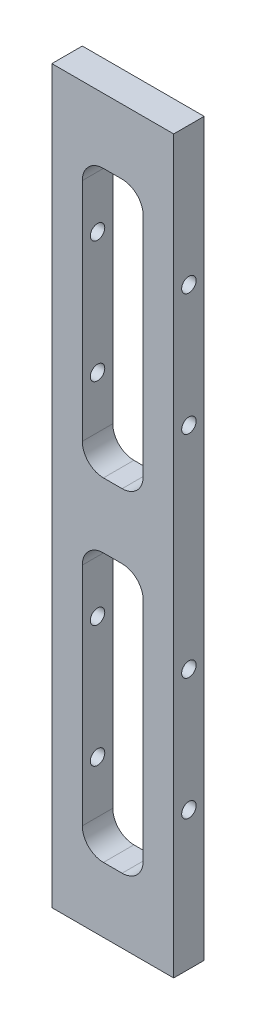
ISO-10303-21;
HEADER;
FILE_DESCRIPTION(('STEP AP214'),'2;1');
FILE_NAME('part.step','',(''),(''),'','','');
FILE_SCHEMA(('AUTOMOTIVE_DESIGN { 1 0 10303 214 1 1 1 1 }'));
ENDSEC;
DATA;
#1=APPLICATION_CONTEXT('core data for automotive mechanical design processes');
#2=APPLICATION_PROTOCOL_DEFINITION('international standard','automotive_design',2000,#1);
#3=PRODUCT_CONTEXT('',#1,'mechanical');
#4=PRODUCT('Part','Part','',(#3));
#5=PRODUCT_RELATED_PRODUCT_CATEGORY('part','',(#4));
#6=PRODUCT_DEFINITION_FORMATION('','',#4);
#7=PRODUCT_DEFINITION_CONTEXT('part definition',#1,'design');
#8=PRODUCT_DEFINITION('design','',#6,#7);
#9=PRODUCT_DEFINITION_SHAPE('','',#8);
#10=(LENGTH_UNIT() NAMED_UNIT(*) SI_UNIT(.MILLI.,.METRE.));
#11=(NAMED_UNIT(*) PLANE_ANGLE_UNIT() SI_UNIT($,.RADIAN.));
#12=(NAMED_UNIT(*) SI_UNIT($,.STERADIAN.) SOLID_ANGLE_UNIT());
#13=UNCERTAINTY_MEASURE_WITH_UNIT(LENGTH_MEASURE(1.E-05),#10,'distance_accuracy_value','');
#14=(GEOMETRIC_REPRESENTATION_CONTEXT(3) GLOBAL_UNCERTAINTY_ASSIGNED_CONTEXT((#13)) GLOBAL_UNIT_ASSIGNED_CONTEXT((#10,
#11,#12)) REPRESENTATION_CONTEXT('',''));
#15=CARTESIAN_POINT('',(0.,0.,0.));
#16=DIRECTION('',(0.,0.,1.));
#17=DIRECTION('',(1.,0.,0.));
#18=AXIS2_PLACEMENT_3D('',#15,#16,#17);
#19=CARTESIAN_POINT('',(9.525,-57.15,-4.7625));
#20=DIRECTION('',(-1.,0.,0.));
#21=DIRECTION('',(0.,0.,-1.));
#22=AXIS2_PLACEMENT_3D('',#19,#20,#21);
#23=PLANE('',#22);
#24=CARTESIAN_POINT('',(9.525,35.56,-2.38125));
#25=DIRECTION('',(-1.,0.,0.));
#26=DIRECTION('',(0.,0.,1.));
#27=AXIS2_PLACEMENT_3D('',#24,#25,#26);
#28=CIRCLE('',#27,1.13029999999999);
#29=CARTESIAN_POINT('',(9.525,35.56,-1.25095000000001));
#30=VERTEX_POINT('',#29);
#31=EDGE_CURVE('E634',#30,#30,#28,.T.);
#32=ORIENTED_EDGE('',*,*,#31,.T.);
#33=EDGE_LOOP('',(#32));
#34=FACE_BOUND('',#33,.T.);
#35=CARTESIAN_POINT('',(9.525,16.51,-2.38125));
#36=DIRECTION('',(-1.,0.,0.));
#37=DIRECTION('',(0.,0.,1.));
#38=AXIS2_PLACEMENT_3D('',#35,#36,#37);
#39=CIRCLE('',#38,1.13029999999999);
#40=CARTESIAN_POINT('',(9.525,16.51,-1.25095000000001));
#41=VERTEX_POINT('',#40);
#42=EDGE_CURVE('E315',#41,#41,#39,.T.);
#43=ORIENTED_EDGE('',*,*,#42,.T.);
#44=EDGE_LOOP('',(#43));
#45=FACE_BOUND('',#44,.T.);
#46=CARTESIAN_POINT('',(9.525,-16.51,-2.38124999999999));
#47=DIRECTION('',(-1.,0.,0.));
#48=DIRECTION('',(0.,0.,1.));
#49=AXIS2_PLACEMENT_3D('',#46,#47,#48);
#50=CIRCLE('',#49,1.13029999999999);
#51=CARTESIAN_POINT('',(9.525,-16.51,-1.25095));
#52=VERTEX_POINT('',#51);
#53=EDGE_CURVE('E312',#52,#52,#50,.T.);
#54=ORIENTED_EDGE('',*,*,#53,.T.);
#55=EDGE_LOOP('',(#54));
#56=FACE_BOUND('',#55,.T.);
#57=CARTESIAN_POINT('',(9.525,-35.56,-2.38124999999999));
#58=DIRECTION('',(-1.,0.,0.));
#59=DIRECTION('',(0.,0.,1.));
#60=AXIS2_PLACEMENT_3D('',#57,#58,#59);
#61=CIRCLE('',#60,1.13029999999999);
#62=CARTESIAN_POINT('',(9.525,-35.56,-1.25095));
#63=VERTEX_POINT('',#62);
#64=EDGE_CURVE('E330',#63,#63,#61,.T.);
#65=ORIENTED_EDGE('',*,*,#64,.T.);
#66=EDGE_LOOP('',(#65));
#67=FACE_BOUND('',#66,.T.);
#68=DIRECTION('',(0.,1.,0.));
#69=VECTOR('',#68,1.);
#70=CARTESIAN_POINT('',(9.525,-57.15,0.));
#71=LINE('',#70,#69);
#72=CARTESIAN_POINT('',(9.525,-57.15,0.));
#73=VERTEX_POINT('',#72);
#74=CARTESIAN_POINT('',(9.525,57.15,0.));
#75=VERTEX_POINT('',#74);
#76=EDGE_CURVE('E214',#73,#75,#71,.T.);
#77=ORIENTED_EDGE('',*,*,#76,.F.);
#78=DIRECTION('',(0.,0.,1.));
#79=VECTOR('',#78,1.);
#80=CARTESIAN_POINT('',(9.525,-57.15,-4.7625));
#81=LINE('',#80,#79);
#82=CARTESIAN_POINT('',(9.525,-57.15,-4.7625));
#83=VERTEX_POINT('',#82);
#84=EDGE_CURVE('E202',#83,#73,#81,.T.);
#85=ORIENTED_EDGE('',*,*,#84,.F.);
#86=DIRECTION('',(0.,1.,0.));
#87=VECTOR('',#86,1.);
#88=CARTESIAN_POINT('',(9.525,-57.15,-4.7625));
#89=LINE('',#88,#87);
#90=CARTESIAN_POINT('',(9.525,57.15,-4.7625));
#91=VERTEX_POINT('',#90);
#92=EDGE_CURVE('E182',#83,#91,#89,.T.);
#93=ORIENTED_EDGE('',*,*,#92,.T.);
#94=DIRECTION('',(0.,0.,1.));
#95=VECTOR('',#94,1.);
#96=CARTESIAN_POINT('',(9.525,57.15,-4.7625));
#97=LINE('',#96,#95);
#98=EDGE_CURVE('E191',#91,#75,#97,.T.);
#99=ORIENTED_EDGE('',*,*,#98,.T.);
#100=EDGE_LOOP('',(#77,#85,#93,#99));
#101=FACE_BOUND('',#100,.T.);
#102=ADVANCED_FACE('F39',(#34,#45,#56,#67,#101),#23,.F.);
#103=CARTESIAN_POINT('',(-9.525,57.15,-4.7625));
#104=DIRECTION('',(0.,-1.,0.));
#105=DIRECTION('',(0.,0.,1.));
#106=AXIS2_PLACEMENT_3D('',#103,#104,#105);
#107=PLANE('',#106);
#108=DIRECTION('',(-1.,0.,0.));
#109=VECTOR('',#108,1.);
#110=CARTESIAN_POINT('',(-9.525,57.15,0.));
#111=LINE('',#110,#109);
#112=CARTESIAN_POINT('',(-9.525,57.15,0.));
#113=VERTEX_POINT('',#112);
#114=EDGE_CURVE('E194',#75,#113,#111,.T.);
#115=ORIENTED_EDGE('',*,*,#114,.F.);
#116=ORIENTED_EDGE('',*,*,#98,.F.);
#117=DIRECTION('',(-1.,0.,0.));
#118=VECTOR('',#117,1.);
#119=CARTESIAN_POINT('',(-9.525,57.15,-4.7625));
#120=LINE('',#119,#118);
#121=CARTESIAN_POINT('',(-9.525,57.15,-4.7625));
#122=VERTEX_POINT('',#121);
#123=EDGE_CURVE('E178',#91,#122,#120,.T.);
#124=ORIENTED_EDGE('',*,*,#123,.T.);
#125=DIRECTION('',(0.,0.,1.));
#126=VECTOR('',#125,1.);
#127=CARTESIAN_POINT('',(-9.525,57.15,-4.7625));
#128=LINE('',#127,#126);
#129=EDGE_CURVE('E199',#122,#113,#128,.T.);
#130=ORIENTED_EDGE('',*,*,#129,.T.);
#131=EDGE_LOOP('',(#115,#116,#124,#130));
#132=FACE_BOUND('',#131,.T.);
#133=ADVANCED_FACE('F192',(#132),#107,.F.);
#134=CARTESIAN_POINT('',(-9.525,-57.15,-4.7625));
#135=DIRECTION('',(1.,0.,0.));
#136=DIRECTION('',(0.,0.,1.));
#137=AXIS2_PLACEMENT_3D('',#134,#135,#136);
#138=PLANE('',#137);
#139=CARTESIAN_POINT('',(-9.525,35.56,-2.38125));
#140=DIRECTION('',(-1.,0.,0.));
#141=DIRECTION('',(0.,0.,1.));
#142=AXIS2_PLACEMENT_3D('',#139,#140,#141);
#143=CIRCLE('',#142,1.13029999999999);
#144=CARTESIAN_POINT('',(-9.525,35.56,-1.25095));
#145=VERTEX_POINT('',#144);
#146=EDGE_CURVE('E604',#145,#145,#143,.T.);
#147=ORIENTED_EDGE('',*,*,#146,.F.);
#148=EDGE_LOOP('',(#147));
#149=FACE_BOUND('',#148,.T.);
#150=CARTESIAN_POINT('',(-9.525,16.51,-2.38125));
#151=DIRECTION('',(-1.,0.,0.));
#152=DIRECTION('',(0.,0.,1.));
#153=AXIS2_PLACEMENT_3D('',#150,#151,#152);
#154=CIRCLE('',#153,1.1303);
#155=CARTESIAN_POINT('',(-9.525,16.51,-1.25095));
#156=VERTEX_POINT('',#155);
#157=EDGE_CURVE('E308',#156,#156,#154,.T.);
#158=ORIENTED_EDGE('',*,*,#157,.F.);
#159=EDGE_LOOP('',(#158));
#160=FACE_BOUND('',#159,.T.);
#161=CARTESIAN_POINT('',(-9.525,-16.51,-2.38124999999999));
#162=DIRECTION('',(-1.,0.,0.));
#163=DIRECTION('',(0.,0.,1.));
#164=AXIS2_PLACEMENT_3D('',#161,#162,#163);
#165=CIRCLE('',#164,1.1303);
#166=CARTESIAN_POINT('',(-9.525,-16.51,-1.25094999999999));
#167=VERTEX_POINT('',#166);
#168=EDGE_CURVE('E304',#167,#167,#165,.T.);
#169=ORIENTED_EDGE('',*,*,#168,.F.);
#170=EDGE_LOOP('',(#169));
#171=FACE_BOUND('',#170,.T.);
#172=CARTESIAN_POINT('',(-9.525,-35.56,-2.38124999999999));
#173=DIRECTION('',(-1.,0.,0.));
#174=DIRECTION('',(0.,0.,1.));
#175=AXIS2_PLACEMENT_3D('',#172,#173,#174);
#176=CIRCLE('',#175,1.13029999999999);
#177=CARTESIAN_POINT('',(-9.525,-35.56,-1.25095));
#178=VERTEX_POINT('',#177);
#179=EDGE_CURVE('E300',#178,#178,#176,.T.);
#180=ORIENTED_EDGE('',*,*,#179,.F.);
#181=EDGE_LOOP('',(#180));
#182=FACE_BOUND('',#181,.T.);
#183=DIRECTION('',(0.,-1.,0.));
#184=VECTOR('',#183,1.);
#185=CARTESIAN_POINT('',(-9.525,-57.15,0.));
#186=LINE('',#185,#184);
#187=CARTESIAN_POINT('',(-9.525,-57.15,0.));
#188=VERTEX_POINT('',#187);
#189=EDGE_CURVE('E205',#113,#188,#186,.T.);
#190=ORIENTED_EDGE('',*,*,#189,.F.);
#191=ORIENTED_EDGE('',*,*,#129,.F.);
#192=DIRECTION('',(0.,-1.,0.));
#193=VECTOR('',#192,1.);
#194=CARTESIAN_POINT('',(-9.525,-57.15,-4.7625));
#195=LINE('',#194,#193);
#196=CARTESIAN_POINT('',(-9.525,-57.15,-4.7625));
#197=VERTEX_POINT('',#196);
#198=EDGE_CURVE('E185',#122,#197,#195,.T.);
#199=ORIENTED_EDGE('',*,*,#198,.T.);
#200=DIRECTION('',(0.,0.,1.));
#201=VECTOR('',#200,1.);
#202=CARTESIAN_POINT('',(-9.525,-57.15,-4.7625));
#203=LINE('',#202,#201);
#204=EDGE_CURVE('E221',#197,#188,#203,.T.);
#205=ORIENTED_EDGE('',*,*,#204,.T.);
#206=EDGE_LOOP('',(#190,#191,#199,#205));
#207=FACE_BOUND('',#206,.T.);
#208=ADVANCED_FACE('F424',(#149,#160,#171,#182,#207),#138,.F.);
#209=CARTESIAN_POINT('',(-9.525,-57.15,-4.7625));
#210=DIRECTION('',(0.,1.,0.));
#211=DIRECTION('',(0.,0.,-1.));
#212=AXIS2_PLACEMENT_3D('',#209,#210,#211);
#213=PLANE('',#212);
#214=DIRECTION('',(1.,0.,0.));
#215=VECTOR('',#214,1.);
#216=CARTESIAN_POINT('',(-9.525,-57.15,0.));
#217=LINE('',#216,#215);
#218=EDGE_CURVE('E203',#188,#73,#217,.T.);
#219=ORIENTED_EDGE('',*,*,#218,.F.);
#220=ORIENTED_EDGE('',*,*,#204,.F.);
#221=DIRECTION('',(1.,0.,0.));
#222=VECTOR('',#221,1.);
#223=CARTESIAN_POINT('',(-9.525,-57.15,-4.7625));
#224=LINE('',#223,#222);
#225=EDGE_CURVE('E212',#197,#83,#224,.T.);
#226=ORIENTED_EDGE('',*,*,#225,.T.);
#227=ORIENTED_EDGE('',*,*,#84,.T.);
#228=EDGE_LOOP('',(#219,#220,#226,#227));
#229=FACE_BOUND('',#228,.T.);
#230=ADVANCED_FACE('F590',(#229),#213,.F.);
#231=CARTESIAN_POINT('',(0.,0.,-4.7625));
#232=DIRECTION('',(0.,0.,1.));
#233=DIRECTION('',(-1.,0.,0.));
#234=AXIS2_PLACEMENT_3D('',#231,#232,#233);
#235=PLANE('',#234);
#236=DIRECTION('',(1.,0.,0.));
#237=VECTOR('',#236,1.);
#238=CARTESIAN_POINT('',(-4.7625,-46.99,-4.7625));
#239=LINE('',#238,#237);
#240=CARTESIAN_POINT('',(-1.4605,-46.99,-4.7625));
#241=VERTEX_POINT('',#240);
#242=CARTESIAN_POINT('',(1.4605,-46.99,-4.7625));
#243=VERTEX_POINT('',#242);
#244=EDGE_CURVE('E354',#241,#243,#239,.T.);
#245=ORIENTED_EDGE('',*,*,#244,.T.);
#246=CARTESIAN_POINT('',(1.4605,-43.688,-4.7625));
#247=DIRECTION('',(0.,0.,-1.));
#248=DIRECTION('',(-1.,0.,0.));
#249=AXIS2_PLACEMENT_3D('',#246,#247,#248);
#250=CIRCLE('',#249,3.302);
#251=CARTESIAN_POINT('',(4.7625,-43.688,-4.7625));
#252=VERTEX_POINT('',#251);
#253=EDGE_CURVE('E260',#252,#243,#250,.T.);
#254=ORIENTED_EDGE('',*,*,#253,.F.);
#255=DIRECTION('',(0.,1.,0.));
#256=VECTOR('',#255,1.);
#257=CARTESIAN_POINT('',(4.7625,-5.08,-4.7625));
#258=LINE('',#257,#256);
#259=CARTESIAN_POINT('',(4.7625,-8.382,-4.7625));
#260=VERTEX_POINT('',#259);
#261=EDGE_CURVE('E357',#252,#260,#258,.T.);
#262=ORIENTED_EDGE('',*,*,#261,.T.);
#263=CARTESIAN_POINT('',(1.4605,-8.382,-4.7625));
#264=DIRECTION('',(0.,0.,-1.));
#265=DIRECTION('',(-1.,0.,0.));
#266=AXIS2_PLACEMENT_3D('',#263,#264,#265);
#267=CIRCLE('',#266,3.302);
#268=CARTESIAN_POINT('',(1.4605,-5.08,-4.7625));
#269=VERTEX_POINT('',#268);
#270=EDGE_CURVE('E272',#269,#260,#267,.T.);
#271=ORIENTED_EDGE('',*,*,#270,.F.);
#272=DIRECTION('',(-1.,0.,0.));
#273=VECTOR('',#272,1.);
#274=CARTESIAN_POINT('',(-4.7625,-5.08,-4.7625));
#275=LINE('',#274,#273);
#276=CARTESIAN_POINT('',(-1.4605,-5.08,-4.7625));
#277=VERTEX_POINT('',#276);
#278=EDGE_CURVE('E342',#269,#277,#275,.T.);
#279=ORIENTED_EDGE('',*,*,#278,.T.);
#280=CARTESIAN_POINT('',(-1.4605,-8.382,-4.7625));
#281=DIRECTION('',(0.,0.,-1.));
#282=DIRECTION('',(-1.,0.,0.));
#283=AXIS2_PLACEMENT_3D('',#280,#281,#282);
#284=CIRCLE('',#283,3.302);
#285=CARTESIAN_POINT('',(-4.7625,-8.382,-4.7625));
#286=VERTEX_POINT('',#285);
#287=EDGE_CURVE('E266',#286,#277,#284,.T.);
#288=ORIENTED_EDGE('',*,*,#287,.F.);
#289=DIRECTION('',(0.,-1.,0.));
#290=VECTOR('',#289,1.);
#291=CARTESIAN_POINT('',(-4.7625,-5.08,-4.7625));
#292=LINE('',#291,#290);
#293=CARTESIAN_POINT('',(-4.7625,-43.688,-4.7625));
#294=VERTEX_POINT('',#293);
#295=EDGE_CURVE('E337',#286,#294,#292,.T.);
#296=ORIENTED_EDGE('',*,*,#295,.T.);
#297=CARTESIAN_POINT('',(-1.4605,-43.688,-4.7625));
#298=DIRECTION('',(0.,0.,-1.));
#299=DIRECTION('',(-1.,0.,0.));
#300=AXIS2_PLACEMENT_3D('',#297,#298,#299);
#301=CIRCLE('',#300,3.302);
#302=EDGE_CURVE('E254',#241,#294,#301,.T.);
#303=ORIENTED_EDGE('',*,*,#302,.F.);
#304=EDGE_LOOP('',(#245,#254,#262,#271,#279,#288,#296,#303));
#305=FACE_BOUND('',#304,.T.);
#306=DIRECTION('',(-1.,0.,0.));
#307=VECTOR('',#306,1.);
#308=CARTESIAN_POINT('',(-4.7625,46.99,-4.7625));
#309=LINE('',#308,#307);
#310=CARTESIAN_POINT('',(1.4605,46.99,-4.7625));
#311=VERTEX_POINT('',#310);
#312=CARTESIAN_POINT('',(-1.4605,46.99,-4.7625));
#313=VERTEX_POINT('',#312);
#314=EDGE_CURVE('E374',#311,#313,#309,.T.);
#315=ORIENTED_EDGE('',*,*,#314,.T.);
#316=CARTESIAN_POINT('',(-1.4605,43.688,-4.7625));
#317=DIRECTION('',(0.,0.,-1.));
#318=DIRECTION('',(-1.,0.,0.));
#319=AXIS2_PLACEMENT_3D('',#316,#317,#318);
#320=CIRCLE('',#319,3.302);
#321=CARTESIAN_POINT('',(-4.7625,43.688,-4.7625));
#322=VERTEX_POINT('',#321);
#323=EDGE_CURVE('E48',#322,#313,#320,.T.);
#324=ORIENTED_EDGE('',*,*,#323,.F.);
#325=DIRECTION('',(0.,-1.,0.));
#326=VECTOR('',#325,1.);
#327=CARTESIAN_POINT('',(-4.7625,5.08,-4.7625));
#328=LINE('',#327,#326);
#329=CARTESIAN_POINT('',(-4.7625,8.382,-4.7625));
#330=VERTEX_POINT('',#329);
#331=EDGE_CURVE('E376',#322,#330,#328,.T.);
#332=ORIENTED_EDGE('',*,*,#331,.T.);
#333=CARTESIAN_POINT('',(-1.4605,8.382,-4.7625));
#334=DIRECTION('',(0.,0.,-1.));
#335=DIRECTION('',(-1.,0.,0.));
#336=AXIS2_PLACEMENT_3D('',#333,#334,#335);
#337=CIRCLE('',#336,3.302);
#338=CARTESIAN_POINT('',(-1.4605,5.08,-4.7625));
#339=VERTEX_POINT('',#338);
#340=EDGE_CURVE('E278',#339,#330,#337,.T.);
#341=ORIENTED_EDGE('',*,*,#340,.F.);
#342=DIRECTION('',(1.,0.,0.));
#343=VECTOR('',#342,1.);
#344=CARTESIAN_POINT('',(-4.7625,5.08,-4.7625));
#345=LINE('',#344,#343);
#346=CARTESIAN_POINT('',(1.4605,5.08,-4.7625));
#347=VERTEX_POINT('',#346);
#348=EDGE_CURVE('E208',#339,#347,#345,.T.);
#349=ORIENTED_EDGE('',*,*,#348,.T.);
#350=CARTESIAN_POINT('',(1.4605,8.382,-4.7625));
#351=DIRECTION('',(0.,0.,-1.));
#352=DIRECTION('',(-1.,0.,0.));
#353=AXIS2_PLACEMENT_3D('',#350,#351,#352);
#354=CIRCLE('',#353,3.302);
#355=CARTESIAN_POINT('',(4.7625,8.382,-4.7625));
#356=VERTEX_POINT('',#355);
#357=EDGE_CURVE('E284',#356,#347,#354,.T.);
#358=ORIENTED_EDGE('',*,*,#357,.F.);
#359=DIRECTION('',(0.,1.,0.));
#360=VECTOR('',#359,1.);
#361=CARTESIAN_POINT('',(4.7625,5.08,-4.7625));
#362=LINE('',#361,#360);
#363=CARTESIAN_POINT('',(4.7625,43.688,-4.7625));
#364=VERTEX_POINT('',#363);
#365=EDGE_CURVE('E351',#356,#364,#362,.T.);
#366=ORIENTED_EDGE('',*,*,#365,.T.);
#367=CARTESIAN_POINT('',(1.4605,43.688,-4.7625));
#368=DIRECTION('',(0.,0.,-1.));
#369=DIRECTION('',(-1.,0.,0.));
#370=AXIS2_PLACEMENT_3D('',#367,#368,#369);
#371=CIRCLE('',#370,3.302);
#372=EDGE_CURVE('E290',#311,#364,#371,.T.);
#373=ORIENTED_EDGE('',*,*,#372,.F.);
#374=EDGE_LOOP('',(#315,#324,#332,#341,#349,#358,#366,#373));
#375=FACE_BOUND('',#374,.T.);
#376=ORIENTED_EDGE('',*,*,#92,.F.);
#377=ORIENTED_EDGE('',*,*,#225,.F.);
#378=ORIENTED_EDGE('',*,*,#198,.F.);
#379=ORIENTED_EDGE('',*,*,#123,.F.);
#380=EDGE_LOOP('',(#376,#377,#378,#379));
#381=FACE_BOUND('',#380,.T.);
#382=ADVANCED_FACE('F180',(#305,#375,#381),#235,.F.);
#383=CARTESIAN_POINT('',(0.,0.,0.));
#384=DIRECTION('',(0.,0.,1.));
#385=DIRECTION('',(-1.,0.,0.));
#386=AXIS2_PLACEMENT_3D('',#383,#384,#385);
#387=PLANE('',#386);
#388=DIRECTION('',(-1.,0.,0.));
#389=VECTOR('',#388,1.);
#390=CARTESIAN_POINT('',(-4.7625,-5.08,0.));
#391=LINE('',#390,#389);
#392=CARTESIAN_POINT('',(1.4605,-5.08,0.));
#393=VERTEX_POINT('',#392);
#394=CARTESIAN_POINT('',(-1.4605,-5.08,0.));
#395=VERTEX_POINT('',#394);
#396=EDGE_CURVE('E348',#393,#395,#391,.T.);
#397=ORIENTED_EDGE('',*,*,#396,.F.);
#398=CARTESIAN_POINT('',(1.4605,-8.382,0.));
#399=DIRECTION('',(0.,0.,-1.));
#400=DIRECTION('',(-1.,0.,0.));
#401=AXIS2_PLACEMENT_3D('',#398,#399,#400);
#402=CIRCLE('',#401,3.302);
#403=CARTESIAN_POINT('',(4.7625,-8.382,0.));
#404=VERTEX_POINT('',#403);
#405=EDGE_CURVE('E275',#404,#393,#402,.F.);
#406=ORIENTED_EDGE('',*,*,#405,.F.);
#407=DIRECTION('',(0.,1.,0.));
#408=VECTOR('',#407,1.);
#409=CARTESIAN_POINT('',(4.7625,-5.08,0.));
#410=LINE('',#409,#408);
#411=CARTESIAN_POINT('',(4.7625,-43.688,0.));
#412=VERTEX_POINT('',#411);
#413=EDGE_CURVE('E345',#412,#404,#410,.T.);
#414=ORIENTED_EDGE('',*,*,#413,.F.);
#415=CARTESIAN_POINT('',(1.4605,-43.688,0.));
#416=DIRECTION('',(0.,0.,-1.));
#417=DIRECTION('',(-1.,0.,0.));
#418=AXIS2_PLACEMENT_3D('',#415,#416,#417);
#419=CIRCLE('',#418,3.302);
#420=CARTESIAN_POINT('',(1.4605,-46.99,0.));
#421=VERTEX_POINT('',#420);
#422=EDGE_CURVE('E263',#421,#412,#419,.F.);
#423=ORIENTED_EDGE('',*,*,#422,.F.);
#424=DIRECTION('',(1.,0.,0.));
#425=VECTOR('',#424,1.);
#426=CARTESIAN_POINT('',(-4.7625,-46.99,0.));
#427=LINE('',#426,#425);
#428=CARTESIAN_POINT('',(-1.4605,-46.99,0.));
#429=VERTEX_POINT('',#428);
#430=EDGE_CURVE('E341',#429,#421,#427,.T.);
#431=ORIENTED_EDGE('',*,*,#430,.F.);
#432=CARTESIAN_POINT('',(-1.4605,-43.688,0.));
#433=DIRECTION('',(0.,0.,-1.));
#434=DIRECTION('',(-1.,0.,0.));
#435=AXIS2_PLACEMENT_3D('',#432,#433,#434);
#436=CIRCLE('',#435,3.302);
#437=CARTESIAN_POINT('',(-4.7625,-43.688,0.));
#438=VERTEX_POINT('',#437);
#439=EDGE_CURVE('E257',#438,#429,#436,.F.);
#440=ORIENTED_EDGE('',*,*,#439,.F.);
#441=DIRECTION('',(0.,-1.,0.));
#442=VECTOR('',#441,1.);
#443=CARTESIAN_POINT('',(-4.7625,-5.08,0.));
#444=LINE('',#443,#442);
#445=CARTESIAN_POINT('',(-4.7625,-8.382,0.));
#446=VERTEX_POINT('',#445);
#447=EDGE_CURVE('E338',#446,#438,#444,.T.);
#448=ORIENTED_EDGE('',*,*,#447,.F.);
#449=CARTESIAN_POINT('',(-1.4605,-8.382,0.));
#450=DIRECTION('',(0.,0.,-1.));
#451=DIRECTION('',(-1.,0.,0.));
#452=AXIS2_PLACEMENT_3D('',#449,#450,#451);
#453=CIRCLE('',#452,3.302);
#454=EDGE_CURVE('E269',#395,#446,#453,.F.);
#455=ORIENTED_EDGE('',*,*,#454,.F.);
#456=EDGE_LOOP('',(#397,#406,#414,#423,#431,#440,#448,#455));
#457=FACE_BOUND('',#456,.T.);
#458=DIRECTION('',(1.,0.,0.));
#459=VECTOR('',#458,1.);
#460=CARTESIAN_POINT('',(-4.7625,5.08,0.));
#461=LINE('',#460,#459);
#462=CARTESIAN_POINT('',(-1.4605,5.08,0.));
#463=VERTEX_POINT('',#462);
#464=CARTESIAN_POINT('',(1.4605,5.08,0.));
#465=VERTEX_POINT('',#464);
#466=EDGE_CURVE('E216',#463,#465,#461,.T.);
#467=ORIENTED_EDGE('',*,*,#466,.F.);
#468=CARTESIAN_POINT('',(-1.4605,8.382,0.));
#469=DIRECTION('',(0.,0.,-1.));
#470=DIRECTION('',(-1.,0.,0.));
#471=AXIS2_PLACEMENT_3D('',#468,#469,#470);
#472=CIRCLE('',#471,3.302);
#473=CARTESIAN_POINT('',(-4.7625,8.382,0.));
#474=VERTEX_POINT('',#473);
#475=EDGE_CURVE('E281',#474,#463,#472,.F.);
#476=ORIENTED_EDGE('',*,*,#475,.F.);
#477=DIRECTION('',(0.,-1.,0.));
#478=VECTOR('',#477,1.);
#479=CARTESIAN_POINT('',(-4.7625,5.08,0.));
#480=LINE('',#479,#478);
#481=CARTESIAN_POINT('',(-4.7625,43.688,0.));
#482=VERTEX_POINT('',#481);
#483=EDGE_CURVE('E367',#482,#474,#480,.T.);
#484=ORIENTED_EDGE('',*,*,#483,.F.);
#485=CARTESIAN_POINT('',(-1.4605,43.688,0.));
#486=DIRECTION('',(0.,0.,-1.));
#487=DIRECTION('',(-1.,0.,0.));
#488=AXIS2_PLACEMENT_3D('',#485,#486,#487);
#489=CIRCLE('',#488,3.302);
#490=CARTESIAN_POINT('',(-1.4605,46.99,0.));
#491=VERTEX_POINT('',#490);
#492=EDGE_CURVE('E11',#491,#482,#489,.F.);
#493=ORIENTED_EDGE('',*,*,#492,.F.);
#494=DIRECTION('',(-1.,0.,0.));
#495=VECTOR('',#494,1.);
#496=CARTESIAN_POINT('',(-4.7625,46.99,0.));
#497=LINE('',#496,#495);
#498=CARTESIAN_POINT('',(1.4605,46.99,0.));
#499=VERTEX_POINT('',#498);
#500=EDGE_CURVE('E365',#499,#491,#497,.T.);
#501=ORIENTED_EDGE('',*,*,#500,.F.);
#502=CARTESIAN_POINT('',(1.4605,43.688,0.));
#503=DIRECTION('',(0.,0.,-1.));
#504=DIRECTION('',(-1.,0.,0.));
#505=AXIS2_PLACEMENT_3D('',#502,#503,#504);
#506=CIRCLE('',#505,3.302);
#507=CARTESIAN_POINT('',(4.7625,43.688,0.));
#508=VERTEX_POINT('',#507);
#509=EDGE_CURVE('E293',#508,#499,#506,.F.);
#510=ORIENTED_EDGE('',*,*,#509,.F.);
#511=DIRECTION('',(0.,1.,0.));
#512=VECTOR('',#511,1.);
#513=CARTESIAN_POINT('',(4.7625,5.08,0.));
#514=LINE('',#513,#512);
#515=CARTESIAN_POINT('',(4.7625,8.382,0.));
#516=VERTEX_POINT('',#515);
#517=EDGE_CURVE('E362',#516,#508,#514,.T.);
#518=ORIENTED_EDGE('',*,*,#517,.F.);
#519=CARTESIAN_POINT('',(1.4605,8.382,0.));
#520=DIRECTION('',(0.,0.,-1.));
#521=DIRECTION('',(-1.,0.,0.));
#522=AXIS2_PLACEMENT_3D('',#519,#520,#521);
#523=CIRCLE('',#522,3.302);
#524=EDGE_CURVE('E287',#465,#516,#523,.F.);
#525=ORIENTED_EDGE('',*,*,#524,.F.);
#526=EDGE_LOOP('',(#467,#476,#484,#493,#501,#510,#518,#525));
#527=FACE_BOUND('',#526,.T.);
#528=ORIENTED_EDGE('',*,*,#76,.T.);
#529=ORIENTED_EDGE('',*,*,#114,.T.);
#530=ORIENTED_EDGE('',*,*,#189,.T.);
#531=ORIENTED_EDGE('',*,*,#218,.T.);
#532=EDGE_LOOP('',(#528,#529,#530,#531));
#533=FACE_BOUND('',#532,.T.);
#534=ADVANCED_FACE('F407',(#457,#527,#533),#387,.T.);
#535=CARTESIAN_POINT('',(4.7625,5.08,0.));
#536=DIRECTION('',(1.,0.,0.));
#537=DIRECTION('',(0.,0.,1.));
#538=AXIS2_PLACEMENT_3D('',#535,#536,#537);
#539=PLANE('',#538);
#540=CARTESIAN_POINT('',(4.7625,35.56,-2.38125));
#541=DIRECTION('',(-1.,0.,0.));
#542=DIRECTION('',(0.,0.,1.));
#543=AXIS2_PLACEMENT_3D('',#540,#541,#542);
#544=CIRCLE('',#543,1.13029999999999);
#545=CARTESIAN_POINT('',(4.7625,35.56,-1.25095000000001));
#546=VERTEX_POINT('',#545);
#547=EDGE_CURVE('E320',#546,#546,#544,.T.);
#548=ORIENTED_EDGE('',*,*,#547,.F.);
#549=EDGE_LOOP('',(#548));
#550=FACE_BOUND('',#549,.T.);
#551=CARTESIAN_POINT('',(4.7625,16.51,-2.38125));
#552=DIRECTION('',(-1.,0.,0.));
#553=DIRECTION('',(0.,0.,1.));
#554=AXIS2_PLACEMENT_3D('',#551,#552,#553);
#555=CIRCLE('',#554,1.13029999999999);
#556=CARTESIAN_POINT('',(4.7625,16.51,-1.25095));
#557=VERTEX_POINT('',#556);
#558=EDGE_CURVE('E307',#557,#557,#555,.T.);
#559=ORIENTED_EDGE('',*,*,#558,.F.);
#560=EDGE_LOOP('',(#559));
#561=FACE_BOUND('',#560,.T.);
#562=ORIENTED_EDGE('',*,*,#517,.T.);
#563=DIRECTION('',(0.,0.,-1.));
#564=VECTOR('',#563,1.);
#565=CARTESIAN_POINT('',(4.7625,43.688,0.));
#566=LINE('',#565,#564);
#567=EDGE_CURVE('E248',#364,#508,#566,.F.);
#568=ORIENTED_EDGE('',*,*,#567,.F.);
#569=ORIENTED_EDGE('',*,*,#365,.F.);
#570=DIRECTION('',(0.,0.,-1.));
#571=VECTOR('',#570,1.);
#572=CARTESIAN_POINT('',(4.7625,8.382,-4.7625));
#573=LINE('',#572,#571);
#574=EDGE_CURVE('E250',#516,#356,#573,.T.);
#575=ORIENTED_EDGE('',*,*,#574,.F.);
#576=EDGE_LOOP('',(#562,#568,#569,#575));
#577=FACE_BOUND('',#576,.T.);
#578=ADVANCED_FACE('F394',(#550,#561,#577),#539,.F.);
#579=CARTESIAN_POINT('',(-4.7625,5.08,0.));
#580=DIRECTION('',(0.,-1.,0.));
#581=DIRECTION('',(0.,0.,1.));
#582=AXIS2_PLACEMENT_3D('',#579,#580,#581);
#583=PLANE('',#582);
#584=ORIENTED_EDGE('',*,*,#466,.T.);
#585=DIRECTION('',(0.,0.,-1.));
#586=VECTOR('',#585,1.);
#587=CARTESIAN_POINT('',(1.4605,5.08,0.));
#588=LINE('',#587,#586);
#589=EDGE_CURVE('E240',#347,#465,#588,.F.);
#590=ORIENTED_EDGE('',*,*,#589,.F.);
#591=ORIENTED_EDGE('',*,*,#348,.F.);
#592=DIRECTION('',(0.,0.,-1.));
#593=VECTOR('',#592,1.);
#594=CARTESIAN_POINT('',(-1.4605,5.08,-4.7625));
#595=LINE('',#594,#593);
#596=EDGE_CURVE('E242',#463,#339,#595,.T.);
#597=ORIENTED_EDGE('',*,*,#596,.F.);
#598=EDGE_LOOP('',(#584,#590,#591,#597));
#599=FACE_BOUND('',#598,.T.);
#600=ADVANCED_FACE('F386',(#599),#583,.F.);
#601=CARTESIAN_POINT('',(-4.7625,5.08,0.));
#602=DIRECTION('',(-1.,0.,0.));
#603=DIRECTION('',(0.,0.,-1.));
#604=AXIS2_PLACEMENT_3D('',#601,#602,#603);
#605=PLANE('',#604);
#606=CARTESIAN_POINT('',(-4.7625,35.56,-2.38125));
#607=DIRECTION('',(1.,0.,0.));
#608=DIRECTION('',(0.,0.,-1.));
#609=AXIS2_PLACEMENT_3D('',#606,#607,#608);
#610=CIRCLE('',#609,1.13029999999999);
#611=CARTESIAN_POINT('',(-4.7625,35.56,-3.51154999999999));
#612=VERTEX_POINT('',#611);
#613=EDGE_CURVE('E43',#612,#612,#610,.T.);
#614=ORIENTED_EDGE('',*,*,#613,.F.);
#615=EDGE_LOOP('',(#614));
#616=FACE_BOUND('',#615,.T.);
#617=CARTESIAN_POINT('',(-4.7625,16.51,-2.38125));
#618=DIRECTION('',(1.,0.,0.));
#619=DIRECTION('',(0.,0.,-1.));
#620=AXIS2_PLACEMENT_3D('',#617,#618,#619);
#621=CIRCLE('',#620,1.13029999999999);
#622=CARTESIAN_POINT('',(-4.7625,16.51,-3.51154999999999));
#623=VERTEX_POINT('',#622);
#624=EDGE_CURVE('E305',#623,#623,#621,.T.);
#625=ORIENTED_EDGE('',*,*,#624,.F.);
#626=EDGE_LOOP('',(#625));
#627=FACE_BOUND('',#626,.T.);
#628=ORIENTED_EDGE('',*,*,#331,.F.);
#629=DIRECTION('',(0.,0.,-1.));
#630=VECTOR('',#629,1.);
#631=CARTESIAN_POINT('',(-4.7625,43.688,-4.7625));
#632=LINE('',#631,#630);
#633=EDGE_CURVE('E244',#482,#322,#632,.T.);
#634=ORIENTED_EDGE('',*,*,#633,.F.);
#635=ORIENTED_EDGE('',*,*,#483,.T.);
#636=DIRECTION('',(0.,0.,-1.));
#637=VECTOR('',#636,1.);
#638=CARTESIAN_POINT('',(-4.7625,8.382,0.));
#639=LINE('',#638,#637);
#640=EDGE_CURVE('E246',#330,#474,#639,.F.);
#641=ORIENTED_EDGE('',*,*,#640,.F.);
#642=EDGE_LOOP('',(#628,#634,#635,#641));
#643=FACE_BOUND('',#642,.T.);
#644=ADVANCED_FACE('F402',(#616,#627,#643),#605,.F.);
#645=CARTESIAN_POINT('',(-4.7625,46.99,0.));
#646=DIRECTION('',(0.,1.,0.));
#647=DIRECTION('',(0.,0.,-1.));
#648=AXIS2_PLACEMENT_3D('',#645,#646,#647);
#649=PLANE('',#648);
#650=ORIENTED_EDGE('',*,*,#500,.T.);
#651=DIRECTION('',(0.,0.,-1.));
#652=VECTOR('',#651,1.);
#653=CARTESIAN_POINT('',(-1.4605,46.99,0.));
#654=LINE('',#653,#652);
#655=EDGE_CURVE('E55',#313,#491,#654,.F.);
#656=ORIENTED_EDGE('',*,*,#655,.F.);
#657=ORIENTED_EDGE('',*,*,#314,.F.);
#658=DIRECTION('',(0.,0.,-1.));
#659=VECTOR('',#658,1.);
#660=CARTESIAN_POINT('',(1.4605,46.99,-4.7625));
#661=LINE('',#660,#659);
#662=EDGE_CURVE('E62',#499,#311,#661,.T.);
#663=ORIENTED_EDGE('',*,*,#662,.F.);
#664=EDGE_LOOP('',(#650,#656,#657,#663));
#665=FACE_BOUND('',#664,.T.);
#666=ADVANCED_FACE('F397',(#665),#649,.F.);
#667=CARTESIAN_POINT('',(-4.7625,-5.08,0.));
#668=DIRECTION('',(-1.,0.,0.));
#669=DIRECTION('',(0.,0.,-1.));
#670=AXIS2_PLACEMENT_3D('',#667,#668,#669);
#671=PLANE('',#670);
#672=CARTESIAN_POINT('',(-4.7625,-16.51,-2.38124999999999));
#673=DIRECTION('',(1.,0.,0.));
#674=DIRECTION('',(0.,0.,-1.));
#675=AXIS2_PLACEMENT_3D('',#672,#673,#674);
#676=CIRCLE('',#675,1.13029999999999);
#677=CARTESIAN_POINT('',(-4.7625,-16.51,-3.51154999999998));
#678=VERTEX_POINT('',#677);
#679=EDGE_CURVE('E303',#678,#678,#676,.T.);
#680=ORIENTED_EDGE('',*,*,#679,.F.);
#681=EDGE_LOOP('',(#680));
#682=FACE_BOUND('',#681,.T.);
#683=CARTESIAN_POINT('',(-4.7625,-35.56,-2.38124999999999));
#684=DIRECTION('',(1.,0.,0.));
#685=DIRECTION('',(0.,0.,-1.));
#686=AXIS2_PLACEMENT_3D('',#683,#684,#685);
#687=CIRCLE('',#686,1.13029999999999);
#688=CARTESIAN_POINT('',(-4.7625,-35.56,-3.51154999999998));
#689=VERTEX_POINT('',#688);
#690=EDGE_CURVE('E296',#689,#689,#687,.T.);
#691=ORIENTED_EDGE('',*,*,#690,.F.);
#692=EDGE_LOOP('',(#691));
#693=FACE_BOUND('',#692,.T.);
#694=ORIENTED_EDGE('',*,*,#295,.F.);
#695=DIRECTION('',(0.,0.,-1.));
#696=VECTOR('',#695,1.);
#697=CARTESIAN_POINT('',(-4.7625,-8.382,-4.7625));
#698=LINE('',#697,#696);
#699=EDGE_CURVE('E228',#446,#286,#698,.T.);
#700=ORIENTED_EDGE('',*,*,#699,.F.);
#701=ORIENTED_EDGE('',*,*,#447,.T.);
#702=DIRECTION('',(0.,0.,-1.));
#703=VECTOR('',#702,1.);
#704=CARTESIAN_POINT('',(-4.7625,-43.688,0.));
#705=LINE('',#704,#703);
#706=EDGE_CURVE('E230',#294,#438,#705,.F.);
#707=ORIENTED_EDGE('',*,*,#706,.F.);
#708=EDGE_LOOP('',(#694,#700,#701,#707));
#709=FACE_BOUND('',#708,.T.);
#710=ADVANCED_FACE('F567',(#682,#693,#709),#671,.F.);
#711=CARTESIAN_POINT('',(-4.7625,-5.08,0.));
#712=DIRECTION('',(0.,1.,0.));
#713=DIRECTION('',(0.,0.,-1.));
#714=AXIS2_PLACEMENT_3D('',#711,#712,#713);
#715=PLANE('',#714);
#716=ORIENTED_EDGE('',*,*,#278,.F.);
#717=DIRECTION('',(0.,0.,-1.));
#718=VECTOR('',#717,1.);
#719=CARTESIAN_POINT('',(1.4605,-5.08,-4.7625));
#720=LINE('',#719,#718);
#721=EDGE_CURVE('E236',#393,#269,#720,.T.);
#722=ORIENTED_EDGE('',*,*,#721,.F.);
#723=ORIENTED_EDGE('',*,*,#396,.T.);
#724=DIRECTION('',(0.,0.,-1.));
#725=VECTOR('',#724,1.);
#726=CARTESIAN_POINT('',(-1.4605,-5.08,0.));
#727=LINE('',#726,#725);
#728=EDGE_CURVE('E238',#277,#395,#727,.F.);
#729=ORIENTED_EDGE('',*,*,#728,.F.);
#730=EDGE_LOOP('',(#716,#722,#723,#729));
#731=FACE_BOUND('',#730,.T.);
#732=ADVANCED_FACE('F563',(#731),#715,.F.);
#733=CARTESIAN_POINT('',(4.7625,-5.08,0.));
#734=DIRECTION('',(1.,0.,0.));
#735=DIRECTION('',(0.,0.,1.));
#736=AXIS2_PLACEMENT_3D('',#733,#734,#735);
#737=PLANE('',#736);
#738=CARTESIAN_POINT('',(4.7625,-16.51,-2.38124999999999));
#739=DIRECTION('',(-1.,0.,0.));
#740=DIRECTION('',(0.,0.,1.));
#741=AXIS2_PLACEMENT_3D('',#738,#739,#740);
#742=CIRCLE('',#741,1.13029999999999);
#743=CARTESIAN_POINT('',(4.7625,-16.51,-1.25095));
#744=VERTEX_POINT('',#743);
#745=EDGE_CURVE('E301',#744,#744,#742,.T.);
#746=ORIENTED_EDGE('',*,*,#745,.F.);
#747=EDGE_LOOP('',(#746));
#748=FACE_BOUND('',#747,.T.);
#749=CARTESIAN_POINT('',(4.7625,-35.56,-2.38124999999999));
#750=DIRECTION('',(-1.,0.,0.));
#751=DIRECTION('',(0.,0.,1.));
#752=AXIS2_PLACEMENT_3D('',#749,#750,#751);
#753=CIRCLE('',#752,1.13029999999999);
#754=CARTESIAN_POINT('',(4.7625,-35.56,-1.25095));
#755=VERTEX_POINT('',#754);
#756=EDGE_CURVE('E299',#755,#755,#753,.T.);
#757=ORIENTED_EDGE('',*,*,#756,.F.);
#758=EDGE_LOOP('',(#757));
#759=FACE_BOUND('',#758,.T.);
#760=ORIENTED_EDGE('',*,*,#413,.T.);
#761=DIRECTION('',(0.,0.,-1.));
#762=VECTOR('',#761,1.);
#763=CARTESIAN_POINT('',(4.7625,-8.382,0.));
#764=LINE('',#763,#762);
#765=EDGE_CURVE('E232',#260,#404,#764,.F.);
#766=ORIENTED_EDGE('',*,*,#765,.F.);
#767=ORIENTED_EDGE('',*,*,#261,.F.);
#768=DIRECTION('',(0.,0.,-1.));
#769=VECTOR('',#768,1.);
#770=CARTESIAN_POINT('',(4.7625,-43.688,-4.7625));
#771=LINE('',#770,#769);
#772=EDGE_CURVE('E234',#412,#252,#771,.T.);
#773=ORIENTED_EDGE('',*,*,#772,.F.);
#774=EDGE_LOOP('',(#760,#766,#767,#773));
#775=FACE_BOUND('',#774,.T.);
#776=ADVANCED_FACE('F566',(#748,#759,#775),#737,.F.);
#777=CARTESIAN_POINT('',(-4.7625,-46.99,0.));
#778=DIRECTION('',(0.,-1.,0.));
#779=DIRECTION('',(0.,0.,1.));
#780=AXIS2_PLACEMENT_3D('',#777,#778,#779);
#781=PLANE('',#780);
#782=ORIENTED_EDGE('',*,*,#430,.T.);
#783=DIRECTION('',(0.,0.,-1.));
#784=VECTOR('',#783,1.);
#785=CARTESIAN_POINT('',(1.4605,-46.99,0.));
#786=LINE('',#785,#784);
#787=EDGE_CURVE('E198',#243,#421,#786,.F.);
#788=ORIENTED_EDGE('',*,*,#787,.F.);
#789=ORIENTED_EDGE('',*,*,#244,.F.);
#790=DIRECTION('',(0.,0.,-1.));
#791=VECTOR('',#790,1.);
#792=CARTESIAN_POINT('',(-1.4605,-46.99,-4.7625));
#793=LINE('',#792,#791);
#794=EDGE_CURVE('E226',#429,#241,#793,.T.);
#795=ORIENTED_EDGE('',*,*,#794,.F.);
#796=EDGE_LOOP('',(#782,#788,#789,#795));
#797=FACE_BOUND('',#796,.T.);
#798=ADVANCED_FACE('F434',(#797),#781,.F.);
#799=CARTESIAN_POINT('',(-1.4605,-43.688,0.));
#800=DIRECTION('',(0.,0.,1.));
#801=DIRECTION('',(-1.,0.,0.));
#802=AXIS2_PLACEMENT_3D('',#799,#800,#801);
#803=CYLINDRICAL_SURFACE('',#802,3.302);
#804=ORIENTED_EDGE('',*,*,#439,.T.);
#805=ORIENTED_EDGE('',*,*,#794,.T.);
#806=ORIENTED_EDGE('',*,*,#302,.T.);
#807=ORIENTED_EDGE('',*,*,#706,.T.);
#808=EDGE_LOOP('',(#804,#805,#806,#807));
#809=FACE_BOUND('',#808,.T.);
#810=ADVANCED_FACE('F430',(#809),#803,.F.);
#811=CARTESIAN_POINT('',(1.4605,-43.688,0.));
#812=DIRECTION('',(0.,0.,1.));
#813=DIRECTION('',(-1.,0.,0.));
#814=AXIS2_PLACEMENT_3D('',#811,#812,#813);
#815=CYLINDRICAL_SURFACE('',#814,3.302);
#816=ORIENTED_EDGE('',*,*,#422,.T.);
#817=ORIENTED_EDGE('',*,*,#772,.T.);
#818=ORIENTED_EDGE('',*,*,#253,.T.);
#819=ORIENTED_EDGE('',*,*,#787,.T.);
#820=EDGE_LOOP('',(#816,#817,#818,#819));
#821=FACE_BOUND('',#820,.T.);
#822=ADVANCED_FACE('F433',(#821),#815,.F.);
#823=CARTESIAN_POINT('',(-1.4605,-8.382,0.));
#824=DIRECTION('',(0.,0.,1.));
#825=DIRECTION('',(-1.,0.,0.));
#826=AXIS2_PLACEMENT_3D('',#823,#824,#825);
#827=CYLINDRICAL_SURFACE('',#826,3.302);
#828=ORIENTED_EDGE('',*,*,#454,.T.);
#829=ORIENTED_EDGE('',*,*,#699,.T.);
#830=ORIENTED_EDGE('',*,*,#287,.T.);
#831=ORIENTED_EDGE('',*,*,#728,.T.);
#832=EDGE_LOOP('',(#828,#829,#830,#831));
#833=FACE_BOUND('',#832,.T.);
#834=ADVANCED_FACE('F438',(#833),#827,.F.);
#835=CARTESIAN_POINT('',(1.4605,-8.382,0.));
#836=DIRECTION('',(0.,0.,1.));
#837=DIRECTION('',(-1.,0.,0.));
#838=AXIS2_PLACEMENT_3D('',#835,#836,#837);
#839=CYLINDRICAL_SURFACE('',#838,3.302);
#840=ORIENTED_EDGE('',*,*,#405,.T.);
#841=ORIENTED_EDGE('',*,*,#721,.T.);
#842=ORIENTED_EDGE('',*,*,#270,.T.);
#843=ORIENTED_EDGE('',*,*,#765,.T.);
#844=EDGE_LOOP('',(#840,#841,#842,#843));
#845=FACE_BOUND('',#844,.T.);
#846=ADVANCED_FACE('F442',(#845),#839,.F.);
#847=CARTESIAN_POINT('',(-1.4605,8.382,0.));
#848=DIRECTION('',(0.,0.,1.));
#849=DIRECTION('',(-1.,0.,0.));
#850=AXIS2_PLACEMENT_3D('',#847,#848,#849);
#851=CYLINDRICAL_SURFACE('',#850,3.302);
#852=ORIENTED_EDGE('',*,*,#475,.T.);
#853=ORIENTED_EDGE('',*,*,#596,.T.);
#854=ORIENTED_EDGE('',*,*,#340,.T.);
#855=ORIENTED_EDGE('',*,*,#640,.T.);
#856=EDGE_LOOP('',(#852,#853,#854,#855));
#857=FACE_BOUND('',#856,.T.);
#858=ADVANCED_FACE('F405',(#857),#851,.F.);
#859=CARTESIAN_POINT('',(1.4605,8.382,0.));
#860=DIRECTION('',(0.,0.,1.));
#861=DIRECTION('',(-1.,0.,0.));
#862=AXIS2_PLACEMENT_3D('',#859,#860,#861);
#863=CYLINDRICAL_SURFACE('',#862,3.302);
#864=ORIENTED_EDGE('',*,*,#524,.T.);
#865=ORIENTED_EDGE('',*,*,#574,.T.);
#866=ORIENTED_EDGE('',*,*,#357,.T.);
#867=ORIENTED_EDGE('',*,*,#589,.T.);
#868=EDGE_LOOP('',(#864,#865,#866,#867));
#869=FACE_BOUND('',#868,.T.);
#870=ADVANCED_FACE('F390',(#869),#863,.F.);
#871=CARTESIAN_POINT('',(1.4605,43.688,0.));
#872=DIRECTION('',(0.,0.,1.));
#873=DIRECTION('',(-1.,0.,0.));
#874=AXIS2_PLACEMENT_3D('',#871,#872,#873);
#875=CYLINDRICAL_SURFACE('',#874,3.302);
#876=ORIENTED_EDGE('',*,*,#509,.T.);
#877=ORIENTED_EDGE('',*,*,#662,.T.);
#878=ORIENTED_EDGE('',*,*,#372,.T.);
#879=ORIENTED_EDGE('',*,*,#567,.T.);
#880=EDGE_LOOP('',(#876,#877,#878,#879));
#881=FACE_BOUND('',#880,.T.);
#882=ADVANCED_FACE('F410',(#881),#875,.F.);
#883=CARTESIAN_POINT('',(-1.4605,43.688,0.));
#884=DIRECTION('',(0.,0.,1.));
#885=DIRECTION('',(-1.,0.,0.));
#886=AXIS2_PLACEMENT_3D('',#883,#884,#885);
#887=CYLINDRICAL_SURFACE('',#886,3.302);
#888=ORIENTED_EDGE('',*,*,#492,.T.);
#889=ORIENTED_EDGE('',*,*,#633,.T.);
#890=ORIENTED_EDGE('',*,*,#323,.T.);
#891=ORIENTED_EDGE('',*,*,#655,.T.);
#892=EDGE_LOOP('',(#888,#889,#890,#891));
#893=FACE_BOUND('',#892,.T.);
#894=ADVANCED_FACE('F41',(#893),#887,.F.);
#895=CARTESIAN_POINT('',(9.525,-35.56,-2.38124999999999));
#896=DIRECTION('',(1.,0.,0.));
#897=DIRECTION('',(0.,0.,1.));
#898=AXIS2_PLACEMENT_3D('',#895,#896,#897);
#899=CYLINDRICAL_SURFACE('',#898,1.13029999999999);
#900=ORIENTED_EDGE('',*,*,#179,.T.);
#901=EDGE_LOOP('',(#900));
#902=FACE_BOUND('',#901,.T.);
#903=ORIENTED_EDGE('',*,*,#690,.T.);
#904=EDGE_LOOP('',(#903));
#905=FACE_BOUND('',#904,.T.);
#906=ADVANCED_FACE('F416',(#902,#905),#899,.F.);
#907=ORIENTED_EDGE('',*,*,#64,.F.);
#908=EDGE_LOOP('',(#907));
#909=FACE_BOUND('',#908,.T.);
#910=ORIENTED_EDGE('',*,*,#756,.T.);
#911=EDGE_LOOP('',(#910));
#912=FACE_BOUND('',#911,.T.);
#913=ADVANCED_FACE('F476',(#909,#912),#899,.F.);
#914=CARTESIAN_POINT('',(9.525,-16.51,-2.38124999999999));
#915=DIRECTION('',(1.,0.,0.));
#916=DIRECTION('',(0.,0.,1.));
#917=AXIS2_PLACEMENT_3D('',#914,#915,#916);
#918=CYLINDRICAL_SURFACE('',#917,1.13029999999999);
#919=ORIENTED_EDGE('',*,*,#53,.F.);
#920=EDGE_LOOP('',(#919));
#921=FACE_BOUND('',#920,.T.);
#922=ORIENTED_EDGE('',*,*,#745,.T.);
#923=EDGE_LOOP('',(#922));
#924=FACE_BOUND('',#923,.T.);
#925=ADVANCED_FACE('F488',(#921,#924),#918,.F.);
#926=ORIENTED_EDGE('',*,*,#168,.T.);
#927=EDGE_LOOP('',(#926));
#928=FACE_BOUND('',#927,.T.);
#929=ORIENTED_EDGE('',*,*,#679,.T.);
#930=EDGE_LOOP('',(#929));
#931=FACE_BOUND('',#930,.T.);
#932=ADVANCED_FACE('F498',(#928,#931),#918,.F.);
#933=CARTESIAN_POINT('',(9.525,16.51,-2.38125));
#934=DIRECTION('',(1.,0.,0.));
#935=DIRECTION('',(0.,0.,1.));
#936=AXIS2_PLACEMENT_3D('',#933,#934,#935);
#937=CYLINDRICAL_SURFACE('',#936,1.13029999999999);
#938=ORIENTED_EDGE('',*,*,#157,.T.);
#939=EDGE_LOOP('',(#938));
#940=FACE_BOUND('',#939,.T.);
#941=ORIENTED_EDGE('',*,*,#624,.T.);
#942=EDGE_LOOP('',(#941));
#943=FACE_BOUND('',#942,.T.);
#944=ADVANCED_FACE('F509',(#940,#943),#937,.F.);
#945=ORIENTED_EDGE('',*,*,#42,.F.);
#946=EDGE_LOOP('',(#945));
#947=FACE_BOUND('',#946,.T.);
#948=ORIENTED_EDGE('',*,*,#558,.T.);
#949=EDGE_LOOP('',(#948));
#950=FACE_BOUND('',#949,.T.);
#951=ADVANCED_FACE('F519',(#947,#950),#937,.F.);
#952=CARTESIAN_POINT('',(9.525,35.56,-2.38125));
#953=DIRECTION('',(1.,0.,0.));
#954=DIRECTION('',(0.,0.,1.));
#955=AXIS2_PLACEMENT_3D('',#952,#953,#954);
#956=CYLINDRICAL_SURFACE('',#955,1.13029999999999);
#957=ORIENTED_EDGE('',*,*,#146,.T.);
#958=EDGE_LOOP('',(#957));
#959=FACE_BOUND('',#958,.T.);
#960=ORIENTED_EDGE('',*,*,#613,.T.);
#961=EDGE_LOOP('',(#960));
#962=FACE_BOUND('',#961,.T.);
#963=ADVANCED_FACE('F529',(#959,#962),#956,.F.);
#964=ORIENTED_EDGE('',*,*,#31,.F.);
#965=EDGE_LOOP('',(#964));
#966=FACE_BOUND('',#965,.T.);
#967=ORIENTED_EDGE('',*,*,#547,.T.);
#968=EDGE_LOOP('',(#967));
#969=FACE_BOUND('',#968,.T.);
#970=ADVANCED_FACE('F539',(#966,#969),#956,.F.);
#971=CLOSED_SHELL('',(#102,#133,#208,#230,#382,#534,#578,#600,#644,#666,#710,#732,#776,#798,
#810,#822,#834,#846,#858,#870,#882,#894,#906,#913,#925,#932,#944,#951,#963,#970));
#972=MANIFOLD_SOLID_BREP('B2',#971);
#973=ADVANCED_BREP_SHAPE_REPRESENTATION('',(#18,#972),#14);
#974=SHAPE_DEFINITION_REPRESENTATION(#9,#973);
ENDSEC;
END-ISO-10303-21;
